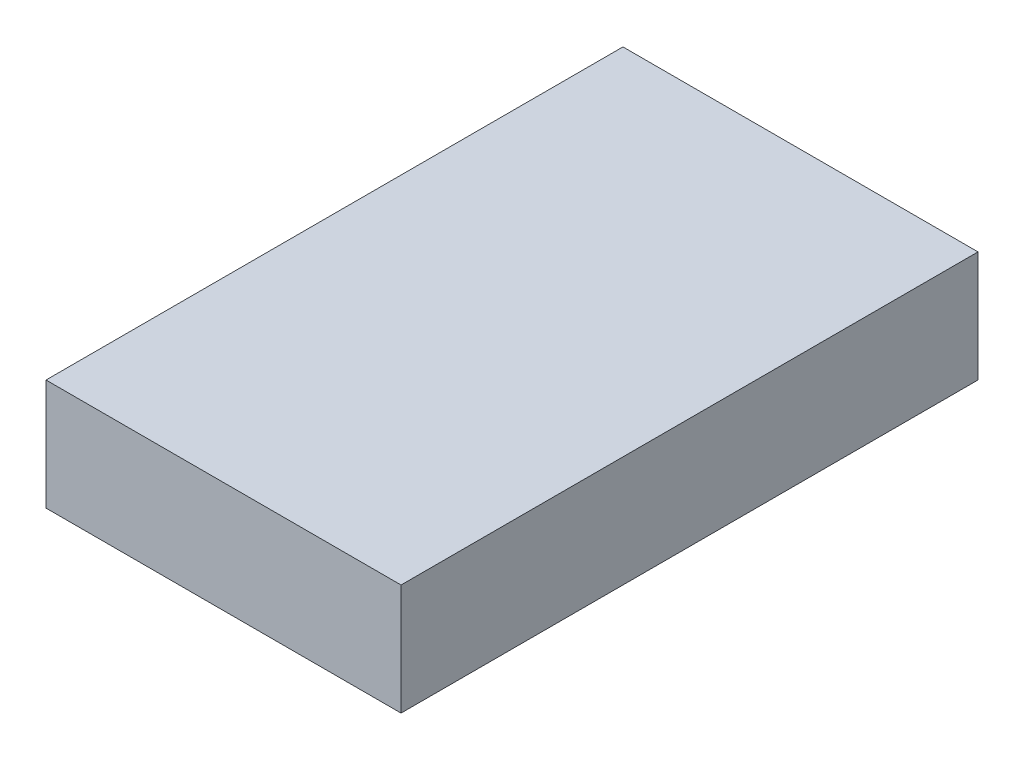
ISO-10303-21;
HEADER;
FILE_DESCRIPTION(('STEP AP214'),'2;1');
FILE_NAME('part.step','',(''),(''),'','','');
FILE_SCHEMA(('AUTOMOTIVE_DESIGN { 1 0 10303 214 1 1 1 1 }'));
ENDSEC;
DATA;
#1=APPLICATION_CONTEXT('core data for automotive mechanical design processes');
#2=APPLICATION_PROTOCOL_DEFINITION('international standard','automotive_design',2000,#1);
#3=PRODUCT_CONTEXT('',#1,'mechanical');
#4=PRODUCT('Part','Part','',(#3));
#5=PRODUCT_RELATED_PRODUCT_CATEGORY('part','',(#4));
#6=PRODUCT_DEFINITION_FORMATION('','',#4);
#7=PRODUCT_DEFINITION_CONTEXT('part definition',#1,'design');
#8=PRODUCT_DEFINITION('design','',#6,#7);
#9=PRODUCT_DEFINITION_SHAPE('','',#8);
#10=(LENGTH_UNIT() NAMED_UNIT(*) SI_UNIT(.MILLI.,.METRE.));
#11=(NAMED_UNIT(*) PLANE_ANGLE_UNIT() SI_UNIT($,.RADIAN.));
#12=(NAMED_UNIT(*) SI_UNIT($,.STERADIAN.) SOLID_ANGLE_UNIT());
#13=UNCERTAINTY_MEASURE_WITH_UNIT(LENGTH_MEASURE(1.E-05),#10,'distance_accuracy_value','');
#14=(GEOMETRIC_REPRESENTATION_CONTEXT(3) GLOBAL_UNCERTAINTY_ASSIGNED_CONTEXT((#13)) GLOBAL_UNIT_ASSIGNED_CONTEXT((#10,
#11,#12)) REPRESENTATION_CONTEXT('',''));
#15=CARTESIAN_POINT('',(0.,0.,0.));
#16=DIRECTION('',(0.,0.,1.));
#17=DIRECTION('',(1.,0.,0.));
#18=AXIS2_PLACEMENT_3D('',#15,#16,#17);
#19=CARTESIAN_POINT('',(-8.,5.,13.));
#20=DIRECTION('',(1.,0.,0.));
#21=DIRECTION('',(0.,0.,-1.));
#22=AXIS2_PLACEMENT_3D('',#19,#20,#21);
#23=PLANE('',#22);
#24=DIRECTION('',(0.,0.,1.));
#25=VECTOR('',#24,1.);
#26=CARTESIAN_POINT('',(-8.,0.,13.));
#27=LINE('',#26,#25);
#28=CARTESIAN_POINT('',(-8.,0.,-13.));
#29=VERTEX_POINT('',#28);
#30=CARTESIAN_POINT('',(-8.,0.,13.));
#31=VERTEX_POINT('',#30);
#32=EDGE_CURVE('E96',#29,#31,#27,.T.);
#33=ORIENTED_EDGE('',*,*,#32,.T.);
#34=DIRECTION('',(0.,-1.,0.));
#35=VECTOR('',#34,1.);
#36=CARTESIAN_POINT('',(-8.,5.,13.));
#37=LINE('',#36,#35);
#38=CARTESIAN_POINT('',(-8.,5.,13.));
#39=VERTEX_POINT('',#38);
#40=EDGE_CURVE('E11',#39,#31,#37,.T.);
#41=ORIENTED_EDGE('',*,*,#40,.F.);
#42=DIRECTION('',(0.,0.,1.));
#43=VECTOR('',#42,1.);
#44=CARTESIAN_POINT('',(-8.,5.,13.));
#45=LINE('',#44,#43);
#46=CARTESIAN_POINT('',(-8.,5.,-13.));
#47=VERTEX_POINT('',#46);
#48=EDGE_CURVE('E84',#47,#39,#45,.T.);
#49=ORIENTED_EDGE('',*,*,#48,.F.);
#50=DIRECTION('',(0.,-1.,0.));
#51=VECTOR('',#50,1.);
#52=CARTESIAN_POINT('',(-8.,5.,-13.));
#53=LINE('',#52,#51);
#54=EDGE_CURVE('E92',#47,#29,#53,.T.);
#55=ORIENTED_EDGE('',*,*,#54,.T.);
#56=EDGE_LOOP('',(#33,#41,#49,#55));
#57=FACE_BOUND('',#56,.T.);
#58=ADVANCED_FACE('F33',(#57),#23,.F.);
#59=CARTESIAN_POINT('',(8.,5.,13.));
#60=DIRECTION('',(0.,0.,-1.));
#61=DIRECTION('',(-1.,0.,0.));
#62=AXIS2_PLACEMENT_3D('',#59,#60,#61);
#63=PLANE('',#62);
#64=DIRECTION('',(1.,0.,0.));
#65=VECTOR('',#64,1.);
#66=CARTESIAN_POINT('',(8.,0.,13.));
#67=LINE('',#66,#65);
#68=CARTESIAN_POINT('',(8.,0.,13.));
#69=VERTEX_POINT('',#68);
#70=EDGE_CURVE('E88',#31,#69,#67,.T.);
#71=ORIENTED_EDGE('',*,*,#70,.T.);
#72=DIRECTION('',(0.,-1.,0.));
#73=VECTOR('',#72,1.);
#74=CARTESIAN_POINT('',(8.,5.,13.));
#75=LINE('',#74,#73);
#76=CARTESIAN_POINT('',(8.,5.,13.));
#77=VERTEX_POINT('',#76);
#78=EDGE_CURVE('E41',#77,#69,#75,.T.);
#79=ORIENTED_EDGE('',*,*,#78,.F.);
#80=DIRECTION('',(1.,0.,0.));
#81=VECTOR('',#80,1.);
#82=CARTESIAN_POINT('',(8.,5.,13.));
#83=LINE('',#82,#81);
#84=EDGE_CURVE('E79',#39,#77,#83,.T.);
#85=ORIENTED_EDGE('',*,*,#84,.F.);
#86=ORIENTED_EDGE('',*,*,#40,.T.);
#87=EDGE_LOOP('',(#71,#79,#85,#86));
#88=FACE_BOUND('',#87,.T.);
#89=ADVANCED_FACE('F87',(#88),#63,.F.);
#90=CARTESIAN_POINT('',(8.,5.,13.));
#91=DIRECTION('',(-1.,0.,0.));
#92=DIRECTION('',(0.,0.,1.));
#93=AXIS2_PLACEMENT_3D('',#90,#91,#92);
#94=PLANE('',#93);
#95=DIRECTION('',(0.,0.,-1.));
#96=VECTOR('',#95,1.);
#97=CARTESIAN_POINT('',(8.,0.,13.));
#98=LINE('',#97,#96);
#99=CARTESIAN_POINT('',(8.,0.,-13.));
#100=VERTEX_POINT('',#99);
#101=EDGE_CURVE('E66',#69,#100,#98,.T.);
#102=ORIENTED_EDGE('',*,*,#101,.T.);
#103=DIRECTION('',(0.,-1.,0.));
#104=VECTOR('',#103,1.);
#105=CARTESIAN_POINT('',(8.,5.,-13.));
#106=LINE('',#105,#104);
#107=CARTESIAN_POINT('',(8.,5.,-13.));
#108=VERTEX_POINT('',#107);
#109=EDGE_CURVE('E89',#108,#100,#106,.T.);
#110=ORIENTED_EDGE('',*,*,#109,.F.);
#111=DIRECTION('',(0.,0.,-1.));
#112=VECTOR('',#111,1.);
#113=CARTESIAN_POINT('',(8.,5.,13.));
#114=LINE('',#113,#112);
#115=EDGE_CURVE('E82',#77,#108,#114,.T.);
#116=ORIENTED_EDGE('',*,*,#115,.F.);
#117=ORIENTED_EDGE('',*,*,#78,.T.);
#118=EDGE_LOOP('',(#102,#110,#116,#117));
#119=FACE_BOUND('',#118,.T.);
#120=ADVANCED_FACE('F90',(#119),#94,.F.);
#121=CARTESIAN_POINT('',(8.,5.,-13.));
#122=DIRECTION('',(0.,0.,1.));
#123=DIRECTION('',(1.,0.,0.));
#124=AXIS2_PLACEMENT_3D('',#121,#122,#123);
#125=PLANE('',#124);
#126=DIRECTION('',(-1.,0.,0.));
#127=VECTOR('',#126,1.);
#128=CARTESIAN_POINT('',(8.,0.,-13.));
#129=LINE('',#128,#127);
#130=EDGE_CURVE('E72',#100,#29,#129,.T.);
#131=ORIENTED_EDGE('',*,*,#130,.T.);
#132=ORIENTED_EDGE('',*,*,#54,.F.);
#133=DIRECTION('',(-1.,0.,0.));
#134=VECTOR('',#133,1.);
#135=CARTESIAN_POINT('',(8.,5.,-13.));
#136=LINE('',#135,#134);
#137=EDGE_CURVE('E49',#108,#47,#136,.T.);
#138=ORIENTED_EDGE('',*,*,#137,.F.);
#139=ORIENTED_EDGE('',*,*,#109,.T.);
#140=EDGE_LOOP('',(#131,#132,#138,#139));
#141=FACE_BOUND('',#140,.T.);
#142=ADVANCED_FACE('F103',(#141),#125,.F.);
#143=CARTESIAN_POINT('',(0.,5.,0.));
#144=DIRECTION('',(0.,1.,0.));
#145=DIRECTION('',(0.,0.,1.));
#146=AXIS2_PLACEMENT_3D('',#143,#144,#145);
#147=PLANE('',#146);
#148=ORIENTED_EDGE('',*,*,#48,.T.);
#149=ORIENTED_EDGE('',*,*,#84,.T.);
#150=ORIENTED_EDGE('',*,*,#115,.T.);
#151=ORIENTED_EDGE('',*,*,#137,.T.);
#152=EDGE_LOOP('',(#148,#149,#150,#151));
#153=FACE_BOUND('',#152,.T.);
#154=ADVANCED_FACE('F80',(#153),#147,.T.);
#155=CARTESIAN_POINT('',(0.,0.,0.));
#156=DIRECTION('',(0.,1.,0.));
#157=DIRECTION('',(0.,0.,1.));
#158=AXIS2_PLACEMENT_3D('',#155,#156,#157);
#159=PLANE('',#158);
#160=ORIENTED_EDGE('',*,*,#32,.F.);
#161=ORIENTED_EDGE('',*,*,#130,.F.);
#162=ORIENTED_EDGE('',*,*,#101,.F.);
#163=ORIENTED_EDGE('',*,*,#70,.F.);
#164=EDGE_LOOP('',(#160,#161,#162,#163));
#165=FACE_BOUND('',#164,.T.);
#166=ADVANCED_FACE('F106',(#165),#159,.F.);
#167=CLOSED_SHELL('',(#58,#89,#120,#142,#154,#166));
#168=MANIFOLD_SOLID_BREP('B2',#167);
#169=ADVANCED_BREP_SHAPE_REPRESENTATION('',(#18,#168),#14);
#170=SHAPE_DEFINITION_REPRESENTATION(#9,#169);
ENDSEC;
END-ISO-10303-21;
